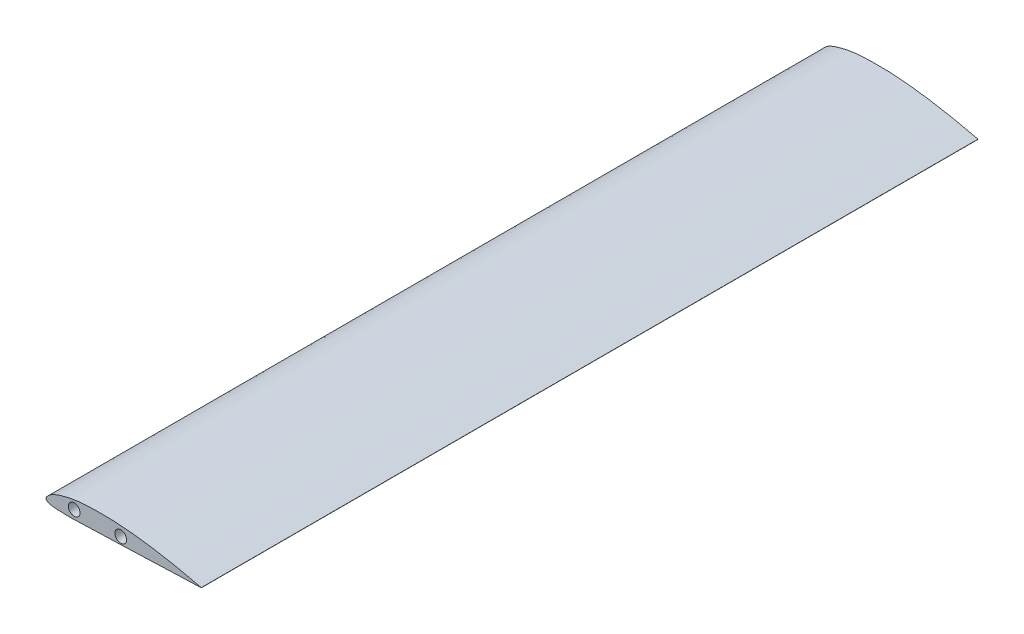
ISO-10303-21;
HEADER;
FILE_DESCRIPTION(('STEP AP214'),'2;1');
FILE_NAME('part.step','',(''),(''),'','','');
FILE_SCHEMA(('AUTOMOTIVE_DESIGN { 1 0 10303 214 1 1 1 1 }'));
ENDSEC;
DATA;
#1=APPLICATION_CONTEXT('core data for automotive mechanical design processes');
#2=APPLICATION_PROTOCOL_DEFINITION('international standard','automotive_design',2000,#1);
#3=PRODUCT_CONTEXT('',#1,'mechanical');
#4=PRODUCT('Part','Part','',(#3));
#5=PRODUCT_RELATED_PRODUCT_CATEGORY('part','',(#4));
#6=PRODUCT_DEFINITION_FORMATION('','',#4);
#7=PRODUCT_DEFINITION_CONTEXT('part definition',#1,'design');
#8=PRODUCT_DEFINITION('design','',#6,#7);
#9=PRODUCT_DEFINITION_SHAPE('','',#8);
#10=(LENGTH_UNIT() NAMED_UNIT(*) SI_UNIT(.MILLI.,.METRE.));
#11=(NAMED_UNIT(*) PLANE_ANGLE_UNIT() SI_UNIT($,.RADIAN.));
#12=(NAMED_UNIT(*) SI_UNIT($,.STERADIAN.) SOLID_ANGLE_UNIT());
#13=UNCERTAINTY_MEASURE_WITH_UNIT(LENGTH_MEASURE(1.E-05),#10,'distance_accuracy_value','');
#14=(GEOMETRIC_REPRESENTATION_CONTEXT(3) GLOBAL_UNCERTAINTY_ASSIGNED_CONTEXT((#13)) GLOBAL_UNIT_ASSIGNED_CONTEXT((#10,
#11,#12)) REPRESENTATION_CONTEXT('',''));
#15=CARTESIAN_POINT('',(0.,0.,0.));
#16=DIRECTION('',(0.,0.,1.));
#17=DIRECTION('',(1.,0.,0.));
#18=AXIS2_PLACEMENT_3D('',#15,#16,#17);
#19=CARTESIAN_POINT('',(50.8,0.0304292,254.));
#20=CARTESIAN_POINT('',(50.6306710197738,0.0705795841665533,254.));
#21=CARTESIAN_POINT('',(50.2920358300322,0.150874953230237,254.));
#22=CARTESIAN_POINT('',(49.7840539226607,0.270975498776032,254.));
#23=CARTESIAN_POINT('',(49.2761038610953,0.390637599713934,254.));
#24=CARTESIAN_POINT('',(48.598975977507,0.548855773634996,254.));
#25=CARTESIAN_POINT('',(47.7526078713655,0.743726875683231,254.));
#26=CARTESIAN_POINT('',(46.7365701063845,0.971867713773341,254.));
#27=CARTESIAN_POINT('',(45.7205157060592,1.19460366208644,254.));
#28=CARTESIAN_POINT('',(44.7045270504281,1.41244204379696,254.));
#29=CARTESIAN_POINT('',(43.6885263658982,1.62504804477995,254.));
#30=CARTESIAN_POINT('',(42.6725441857287,1.83238449031828,254.));
#31=CARTESIAN_POINT('',(41.6565222637134,2.0340240328905,254.));
#32=CARTESIAN_POINT('',(40.6405455167654,2.23021224046285,254.));
#33=CARTESIAN_POINT('',(39.6245166446479,2.42035781192709,254.));
#34=CARTESIAN_POINT('',(38.6085268570951,2.6047922516619,254.));
#35=CARTESIAN_POINT('',(37.5924948503536,2.78305004819871,254.));
#36=CARTESIAN_POINT('',(36.5764958949881,2.95547100648453,254.));
#37=CARTESIAN_POINT('',(35.5604833867921,3.12174023606919,254.));
#38=CARTESIAN_POINT('',(34.5444958340601,3.28187656499848,254.));
#39=CARTESIAN_POINT('',(33.528530885199,3.43549393879397,254.));
#40=CARTESIAN_POINT('',(32.5125313517329,3.58168689265324,254.));
#41=CARTESIAN_POINT('',(31.4965530833238,3.72022244299993,254.));
#42=CARTESIAN_POINT('',(30.480541120526,3.85017813303616,254.));
#43=CARTESIAN_POINT('',(29.1265064834059,4.011498540776,254.));
#44=CARTESIAN_POINT('',(27.7717198981147,4.15466436073355,254.));
#45=CARTESIAN_POINT('',(26.4163974210718,4.27955731480192,254.));
#46=CARTESIAN_POINT('',(25.4003621723501,4.36405904277595,254.));
#47=CARTESIAN_POINT('',(24.3843390537598,4.43934411421819,254.));
#48=CARTESIAN_POINT('',(23.0300417236,4.5266421839161,254.));
#49=CARTESIAN_POINT('',(21.6752328879528,4.59249103705621,254.));
#50=CARTESIAN_POINT('',(20.3201557818423,4.63369139201363,254.));
#51=CARTESIAN_POINT('',(19.3040696603435,4.65133426434404,254.));
#52=CARTESIAN_POINT('',(18.2879970526581,4.65656685695099,254.));
#53=CARTESIAN_POINT('',(17.2719426643878,4.65030742746952,254.));
#54=CARTESIAN_POINT('',(16.2559013261349,4.63383781370269,254.));
#55=CARTESIAN_POINT('',(15.2398767242405,4.60782186302995,254.));
#56=CARTESIAN_POINT('',(14.2237624314781,4.57411399170416,254.));
#57=CARTESIAN_POINT('',(13.2075470139113,4.52827070069848,254.));
#58=CARTESIAN_POINT('',(12.1911996459811,4.46545091171715,254.));
#59=CARTESIAN_POINT('',(11.1746982500042,4.38044787039092,254.));
#60=CARTESIAN_POINT('',(10.1579970051469,4.26835711799356,254.));
#61=CARTESIAN_POINT('',(9.14144422918915,4.12342634073343,254.));
#62=CARTESIAN_POINT('',(8.12503711717973,3.94534518557721,254.));
#63=CARTESIAN_POINT('',(7.10834817357695,3.7353756412971,254.));
#64=CARTESIAN_POINT('',(6.09103596588232,3.4913945761663,254.));
#65=CARTESIAN_POINT('',(5.07322112037564,3.20651396486868,254.));
#66=CARTESIAN_POINT('',(4.05555574990855,2.87195009447788,254.));
#67=CARTESIAN_POINT('',(3.20850188680405,2.55234560971134,254.));
#68=CARTESIAN_POINT('',(2.53341564299715,2.25166437345684,254.));
#69=CARTESIAN_POINT('',(2.02181497373695,1.98975816391644,254.));
#70=CARTESIAN_POINT('',(1.50561058745153,1.6785728005285,254.));
#71=CARTESIAN_POINT('',(1.02906174622136,1.31544995460392,254.));
#72=CARTESIAN_POINT('',(0.671173287285011,0.970843301204033,254.));
#73=CARTESIAN_POINT('',(0.397988147879069,0.69386553737046,254.));
#74=CARTESIAN_POINT('',(0.224504552344574,0.491374229286231,254.));
#75=CARTESIAN_POINT('',(0.110424088724365,0.31710182906547,254.));
#76=CARTESIAN_POINT('',(0.0546219702706747,0.202939448990948,254.));
#77=CARTESIAN_POINT('',(0.0189760115069539,0.10458386657566,254.));
#78=CARTESIAN_POINT('',(-0.0132923114343266,-0.0375239455911414,254.));
#79=CARTESIAN_POINT('',(0.00312147691093695,-0.185399330153303,254.));
#80=CARTESIAN_POINT('',(0.0545786117163274,-0.314116805654463,254.));
#81=CARTESIAN_POINT('',(0.10986225496766,-0.416474840227819,254.));
#82=CARTESIAN_POINT('',(0.222129250789671,-0.565689070251393,254.));
#83=CARTESIAN_POINT('',(0.393319805841126,-0.723830258003126,254.));
#84=CARTESIAN_POINT('',(0.660323780721179,-0.904551123356242,254.));
#85=CARTESIAN_POINT('',(1.03921450896585,-1.05093711353655,254.));
#86=CARTESIAN_POINT('',(1.52254987222713,-1.14831749172068,254.));
#87=CARTESIAN_POINT('',(2.0301899332059,-1.24926173467476,254.));
#88=CARTESIAN_POINT('',(2.53855615796006,-1.32684509795893,254.));
#89=CARTESIAN_POINT('',(3.21597130686952,-1.39867283087912,254.));
#90=CARTESIAN_POINT('',(4.06357406218937,-1.44738277140595,254.));
#91=CARTESIAN_POINT('',(5.07964625016984,-1.49564975144552,254.));
#92=CARTESIAN_POINT('',(6.0958432696135,-1.52465882720205,254.));
#93=CARTESIAN_POINT('',(7.11195166110082,-1.53841432772215,254.));
#94=CARTESIAN_POINT('',(8.12802940228787,-1.53883277396068,254.));
#95=CARTESIAN_POINT('',(9.14406755149236,-1.52797744925502,254.));
#96=CARTESIAN_POINT('',(10.4988520845856,-1.50158787792268,254.));
#97=CARTESIAN_POINT('',(11.8534935003071,-1.46132453292282,254.));
#98=CARTESIAN_POINT('',(13.2080403398518,-1.4134146374631,254.));
#99=CARTESIAN_POINT('',(14.2240157304614,-1.37530009783937,254.));
#100=CARTESIAN_POINT('',(15.2399886703084,-1.33631749729496,254.));
#101=CARTESIAN_POINT('',(16.2559861689052,-1.29810995512659,254.));
#102=CARTESIAN_POINT('',(17.2719941770759,-1.26071417961647,254.));
#103=CARTESIAN_POINT('',(18.2879947933126,-1.22356128004204,254.));
#104=CARTESIAN_POINT('',(19.3040013573683,-1.18675922158669,254.));
#105=CARTESIAN_POINT('',(20.3200028452941,-1.14983452199506,254.));
#106=CARTESIAN_POINT('',(21.3360026668478,-1.11274532920441,254.));
#107=CARTESIAN_POINT('',(22.3520031870673,-1.07552275046385,254.));
#108=CARTESIAN_POINT('',(23.3679994822182,-1.03808392176687,254.));
#109=CARTESIAN_POINT('',(24.3840013698953,-1.00072947091902,254.));
#110=CARTESIAN_POINT('',(25.3999987745551,-0.963253256998965,254.));
#111=CARTESIAN_POINT('',(26.4159991736496,-0.925875261572413,254.));
#112=CARTESIAN_POINT('',(27.4319989339051,-0.888530702527209,254.));
#113=CARTESIAN_POINT('',(29.1253338326584,-0.826411064856333,254.));
#114=CARTESIAN_POINT('',(30.8186661224185,-0.764237313762707,254.));
#115=CARTESIAN_POINT('',(32.8506686004358,-0.689696522061094,254.));
#116=CARTESIAN_POINT('',(34.2053308737201,-0.639826759521619,254.));
#117=CARTESIAN_POINT('',(35.5600014894901,-0.590167224598964,254.));
#118=CARTESIAN_POINT('',(36.5759984643119,-0.552780717457323,254.));
#119=CARTESIAN_POINT('',(37.5920015480668,-0.515543619607603,254.));
#120=CARTESIAN_POINT('',(38.6079984486163,-0.478155090073316,254.));
#121=CARTESIAN_POINT('',(39.6240015522729,-0.440918534137253,254.));
#122=CARTESIAN_POINT('',(40.6399984474876,-0.403529859339331,254.));
#123=CARTESIAN_POINT('',(41.6560015525816,-0.366293342543707,254.));
#124=CARTESIAN_POINT('',(42.6719984473813,-0.328904656447539,254.));
#125=CARTESIAN_POINT('',(43.6880015526977,-0.291668145704426,254.));
#126=CARTESIAN_POINT('',(44.7039984470231,-0.254279446696447,254.));
#127=CARTESIAN_POINT('',(45.7200015540143,-0.217042981548029,254.));
#128=CARTESIAN_POINT('',(46.7359984421147,-0.179654113072937,254.));
#129=CARTESIAN_POINT('',(47.7520015723316,-0.142418280197757,254.));
#130=CARTESIAN_POINT('',(48.5986656770232,-0.111258919636082,254.));
#131=CARTESIAN_POINT('',(49.2760001006052,-0.0864135387726242,254.));
#132=CARTESIAN_POINT('',(49.7839998488803,-0.0677630875746182,254.));
#133=CARTESIAN_POINT('',(50.2920011253363,-0.0491372881430579,254.));
#134=CARTESIAN_POINT('',(50.6306668346258,-0.0366652370098474,254.));
#135=CARTESIAN_POINT('',(50.8,-0.0304292,254.));
#136=B_SPLINE_CURVE_WITH_KNOTS('',3,(#19,#20,#21,#22,#23,#24,#25,#26,#27,#28,#29,#30,#31,#32,
#33,#34,#35,#36,#37,#38,#39,#40,#41,#42,#43,#44,#45,#46,#47,#48,#49,#50,#51,#52,#53,#54,#55,#56,
#57,#58,#59,#60,#61,#62,#63,#64,#65,#66,#67,#68,#69,#70,#71,#72,#73,#74,#75,#76,#77,#78,#79,#80,
#81,#82,#83,#84,#85,#86,#87,#88,#89,#90,#91,#92,#93,#94,#95,#96,#97,#98,#99,#100,#101,#102,#103,
#104,#105,#106,#107,#108,#109,#110,#111,#112,#113,#114,#115,#116,#117,#118,#119,#120,#121,#122,
#123,#124,#125,#126,#127,#128,#129,#130,#131,#132,#133,#134,#135),.UNSPECIFIED.,.F.,.F.,(4,1,1,
1,1,1,1,1,1,1,1,1,1,1,1,1,1,1,1,1,1,1,1,1,1,1,1,1,1,1,1,1,1,1,1,1,1,1,1,1,1,1,1,1,1,1,1,1,1,1,1,
1,1,1,1,1,1,1,1,1,1,1,1,1,1,1,1,1,1,1,1,1,1,1,1,1,1,1,1,1,1,1,1,1,1,1,1,1,1,1,1,1,1,1,1,1,1,1,1,
1,1,1,1,1,1,1,1,1,1,1,1,1,1,1,4),(0.,0.00502783507920512,0.0100549940344635,0.0150810297240759,
0.0201050549080901,0.0301452607809433,0.0401736458927437,0.0501907944797705,0.0601976798950131,
0.0701942255550733,0.080180376641249,0.0901559102827993,0.100121105793046,0.110075702815163,
0.120020101260909,0.12995427083149,0.139878706126609,0.149793490904473,0.159698811392376,
0.169594433213407,0.179479778460019,0.189354743837752,0.199219015443769,0.209072795450207,
0.228751158154273,0.238577241843568,0.248395636485294,0.258207018047657,0.268011852233636,
0.28760402315173,0.297393126728297,0.30717925271197,0.316964017963334,0.326748818989175,
0.336534714870927,0.346322473718417,0.356112722227348,0.365907651807351,0.375711463271154,
0.385530878969925,0.395375762487733,0.405259304622106,0.415192461064141,0.425184025337781,
0.435248335040234,0.445412190892236,0.455710778825161,0.466190958855658,0.471552192168147,
0.477054503678275,0.482786726573929,0.488945835105149,0.494316032866102,0.497126416153154,
0.500187367762256,0.50200086881537,0.50312820232303,0.503849971017213,0.505020136520667,
0.507317904862695,0.507986558007653,0.509023585585765,0.510668218535328,0.513358347504693,
0.515715811851598,0.519949385272463,0.524973187970153,0.529954400275476,0.534903201933464,
0.539824122915189,0.549630394385821,0.559425368878799,0.569214167199772,0.578999733437889,
0.588784364017045,0.598569510856094,0.608355932640458,0.627933314763684,0.637723968115274,
0.647515400204077,0.657307127187741,0.667098669129828,0.676889956114584,0.68668111741491,
0.69647218967302,0.706263279690747,0.716054423133804,0.725845620221906,0.735636871174764,
0.745428122127622,0.755219391084224,0.765010642037082,0.774801875010609,0.784593090029218,
0.813966735085043,0.823757950103652,0.843340416050707,0.853131631069315,0.862922864042843,
0.872714079061451,0.882505312034979,0.892296527053587,0.902087760027115,0.911878975045723,
0.92167020801925,0.931461423037859,0.941252656011386,0.951043871029995,0.960835104003522,
0.970626319022131,0.980417551995658,0.985313159504962,0.990208767014267,0.995104374523571,1.),.UNSPECIFIED.);
#137=DIRECTION('',(0.,0.,-1.));
#138=VECTOR('',#137,1.);
#139=SURFACE_OF_LINEAR_EXTRUSION('',#136,#138);
#140=CARTESIAN_POINT('',(50.8,0.0304292,0.));
#141=CARTESIAN_POINT('',(50.6306710197738,0.0705795841665533,0.));
#142=CARTESIAN_POINT('',(50.2920358300322,0.150874953230237,0.));
#143=CARTESIAN_POINT('',(49.7840539226607,0.270975498776032,0.));
#144=CARTESIAN_POINT('',(49.2761038610953,0.390637599713934,0.));
#145=CARTESIAN_POINT('',(48.598975977507,0.548855773634996,0.));
#146=CARTESIAN_POINT('',(47.7526078713655,0.743726875683231,0.));
#147=CARTESIAN_POINT('',(46.7365701063845,0.971867713773341,0.));
#148=CARTESIAN_POINT('',(45.7205157060592,1.19460366208644,0.));
#149=CARTESIAN_POINT('',(44.7045270504281,1.41244204379696,0.));
#150=CARTESIAN_POINT('',(43.6885263658982,1.62504804477995,0.));
#151=CARTESIAN_POINT('',(42.6725441857287,1.83238449031828,0.));
#152=CARTESIAN_POINT('',(41.6565222637134,2.0340240328905,0.));
#153=CARTESIAN_POINT('',(40.6405455167654,2.23021224046285,0.));
#154=CARTESIAN_POINT('',(39.6245166446479,2.42035781192709,0.));
#155=CARTESIAN_POINT('',(38.6085268570951,2.6047922516619,0.));
#156=CARTESIAN_POINT('',(37.5924948503536,2.78305004819871,0.));
#157=CARTESIAN_POINT('',(36.5764958949881,2.95547100648453,0.));
#158=CARTESIAN_POINT('',(35.5604833867921,3.12174023606919,0.));
#159=CARTESIAN_POINT('',(34.5444958340601,3.28187656499848,0.));
#160=CARTESIAN_POINT('',(33.528530885199,3.43549393879397,0.));
#161=CARTESIAN_POINT('',(32.5125313517329,3.58168689265324,0.));
#162=CARTESIAN_POINT('',(31.4965530833238,3.72022244299993,0.));
#163=CARTESIAN_POINT('',(30.480541120526,3.85017813303616,0.));
#164=CARTESIAN_POINT('',(29.1265064834059,4.011498540776,0.));
#165=CARTESIAN_POINT('',(27.7717198981147,4.15466436073355,0.));
#166=CARTESIAN_POINT('',(26.4163974210718,4.27955731480192,0.));
#167=CARTESIAN_POINT('',(25.4003621723501,4.36405904277595,0.));
#168=CARTESIAN_POINT('',(24.3843390537598,4.43934411421819,0.));
#169=CARTESIAN_POINT('',(23.0300417236,4.5266421839161,0.));
#170=CARTESIAN_POINT('',(21.6752328879528,4.59249103705621,0.));
#171=CARTESIAN_POINT('',(20.3201557818423,4.63369139201363,0.));
#172=CARTESIAN_POINT('',(19.3040696603435,4.65133426434404,0.));
#173=CARTESIAN_POINT('',(18.2879970526581,4.65656685695099,0.));
#174=CARTESIAN_POINT('',(17.2719426643878,4.65030742746952,0.));
#175=CARTESIAN_POINT('',(16.2559013261349,4.63383781370269,0.));
#176=CARTESIAN_POINT('',(15.2398767242405,4.60782186302995,0.));
#177=CARTESIAN_POINT('',(14.2237624314781,4.57411399170416,0.));
#178=CARTESIAN_POINT('',(13.2075470139113,4.52827070069848,0.));
#179=CARTESIAN_POINT('',(12.1911996459811,4.46545091171715,0.));
#180=CARTESIAN_POINT('',(11.1746982500042,4.38044787039092,0.));
#181=CARTESIAN_POINT('',(10.1579970051469,4.26835711799356,0.));
#182=CARTESIAN_POINT('',(9.14144422918915,4.12342634073343,0.));
#183=CARTESIAN_POINT('',(8.12503711717973,3.94534518557721,0.));
#184=CARTESIAN_POINT('',(7.10834817357695,3.7353756412971,0.));
#185=CARTESIAN_POINT('',(6.09103596588232,3.4913945761663,0.));
#186=CARTESIAN_POINT('',(5.07322112037564,3.20651396486868,0.));
#187=CARTESIAN_POINT('',(4.05555574990855,2.87195009447788,0.));
#188=CARTESIAN_POINT('',(3.20850188680405,2.55234560971134,0.));
#189=CARTESIAN_POINT('',(2.53341564299715,2.25166437345684,0.));
#190=CARTESIAN_POINT('',(2.02181497373695,1.98975816391644,0.));
#191=CARTESIAN_POINT('',(1.50561058745153,1.6785728005285,0.));
#192=CARTESIAN_POINT('',(1.02906174622136,1.31544995460392,0.));
#193=CARTESIAN_POINT('',(0.671173287285011,0.970843301204033,0.));
#194=CARTESIAN_POINT('',(0.397988147879069,0.69386553737046,0.));
#195=CARTESIAN_POINT('',(0.224504552344574,0.491374229286231,0.));
#196=CARTESIAN_POINT('',(0.110424088724365,0.31710182906547,0.));
#197=CARTESIAN_POINT('',(0.0546219702706747,0.202939448990948,0.));
#198=CARTESIAN_POINT('',(0.0189760115069539,0.10458386657566,0.));
#199=CARTESIAN_POINT('',(-0.0132923114343266,-0.0375239455911414,0.));
#200=CARTESIAN_POINT('',(0.00312147691093695,-0.185399330153303,0.));
#201=CARTESIAN_POINT('',(0.0545786117163274,-0.314116805654463,0.));
#202=CARTESIAN_POINT('',(0.10986225496766,-0.416474840227819,0.));
#203=CARTESIAN_POINT('',(0.222129250789671,-0.565689070251393,0.));
#204=CARTESIAN_POINT('',(0.393319805841126,-0.723830258003126,0.));
#205=CARTESIAN_POINT('',(0.660323780721179,-0.904551123356242,0.));
#206=CARTESIAN_POINT('',(1.03921450896585,-1.05093711353655,0.));
#207=CARTESIAN_POINT('',(1.52254987222713,-1.14831749172068,0.));
#208=CARTESIAN_POINT('',(2.0301899332059,-1.24926173467476,0.));
#209=CARTESIAN_POINT('',(2.53855615796006,-1.32684509795893,0.));
#210=CARTESIAN_POINT('',(3.21597130686952,-1.39867283087912,0.));
#211=CARTESIAN_POINT('',(4.06357406218937,-1.44738277140595,0.));
#212=CARTESIAN_POINT('',(5.07964625016984,-1.49564975144552,0.));
#213=CARTESIAN_POINT('',(6.0958432696135,-1.52465882720205,0.));
#214=CARTESIAN_POINT('',(7.11195166110082,-1.53841432772215,0.));
#215=CARTESIAN_POINT('',(8.12802940228787,-1.53883277396068,0.));
#216=CARTESIAN_POINT('',(9.14406755149236,-1.52797744925502,0.));
#217=CARTESIAN_POINT('',(10.4988520845856,-1.50158787792268,0.));
#218=CARTESIAN_POINT('',(11.8534935003071,-1.46132453292282,0.));
#219=CARTESIAN_POINT('',(13.2080403398518,-1.4134146374631,0.));
#220=CARTESIAN_POINT('',(14.2240157304614,-1.37530009783937,0.));
#221=CARTESIAN_POINT('',(15.2399886703084,-1.33631749729496,0.));
#222=CARTESIAN_POINT('',(16.2559861689052,-1.29810995512659,0.));
#223=CARTESIAN_POINT('',(17.2719941770759,-1.26071417961647,0.));
#224=CARTESIAN_POINT('',(18.2879947933126,-1.22356128004204,0.));
#225=CARTESIAN_POINT('',(19.3040013573683,-1.18675922158669,0.));
#226=CARTESIAN_POINT('',(20.3200028452941,-1.14983452199506,0.));
#227=CARTESIAN_POINT('',(21.3360026668478,-1.11274532920441,0.));
#228=CARTESIAN_POINT('',(22.3520031870673,-1.07552275046385,0.));
#229=CARTESIAN_POINT('',(23.3679994822182,-1.03808392176687,0.));
#230=CARTESIAN_POINT('',(24.3840013698953,-1.00072947091902,0.));
#231=CARTESIAN_POINT('',(25.3999987745551,-0.963253256998965,0.));
#232=CARTESIAN_POINT('',(26.4159991736496,-0.925875261572413,0.));
#233=CARTESIAN_POINT('',(27.4319989339051,-0.888530702527209,0.));
#234=CARTESIAN_POINT('',(29.1253338326584,-0.826411064856333,0.));
#235=CARTESIAN_POINT('',(30.8186661224185,-0.764237313762707,0.));
#236=CARTESIAN_POINT('',(32.8506686004358,-0.689696522061094,0.));
#237=CARTESIAN_POINT('',(34.2053308737201,-0.639826759521619,0.));
#238=CARTESIAN_POINT('',(35.5600014894901,-0.590167224598964,0.));
#239=CARTESIAN_POINT('',(36.5759984643119,-0.552780717457323,0.));
#240=CARTESIAN_POINT('',(37.5920015480668,-0.515543619607603,0.));
#241=CARTESIAN_POINT('',(38.6079984486163,-0.478155090073316,0.));
#242=CARTESIAN_POINT('',(39.6240015522729,-0.440918534137253,0.));
#243=CARTESIAN_POINT('',(40.6399984474876,-0.403529859339331,0.));
#244=CARTESIAN_POINT('',(41.6560015525816,-0.366293342543707,0.));
#245=CARTESIAN_POINT('',(42.6719984473813,-0.328904656447539,0.));
#246=CARTESIAN_POINT('',(43.6880015526977,-0.291668145704426,0.));
#247=CARTESIAN_POINT('',(44.7039984470231,-0.254279446696447,0.));
#248=CARTESIAN_POINT('',(45.7200015540143,-0.217042981548029,0.));
#249=CARTESIAN_POINT('',(46.7359984421147,-0.179654113072937,0.));
#250=CARTESIAN_POINT('',(47.7520015723316,-0.142418280197757,0.));
#251=CARTESIAN_POINT('',(48.5986656770232,-0.111258919636082,0.));
#252=CARTESIAN_POINT('',(49.2760001006052,-0.0864135387726242,0.));
#253=CARTESIAN_POINT('',(49.7839998488803,-0.0677630875746182,0.));
#254=CARTESIAN_POINT('',(50.2920011253363,-0.0491372881430579,0.));
#255=CARTESIAN_POINT('',(50.6306668346258,-0.0366652370098474,0.));
#256=CARTESIAN_POINT('',(50.8,-0.0304292,0.));
#257=B_SPLINE_CURVE_WITH_KNOTS('',3,(#140,#141,#142,#143,#144,#145,#146,#147,#148,#149,#150,
#151,#152,#153,#154,#155,#156,#157,#158,#159,#160,#161,#162,#163,#164,#165,#166,#167,#168,#169,
#170,#171,#172,#173,#174,#175,#176,#177,#178,#179,#180,#181,#182,#183,#184,#185,#186,#187,#188,
#189,#190,#191,#192,#193,#194,#195,#196,#197,#198,#199,#200,#201,#202,#203,#204,#205,#206,#207,
#208,#209,#210,#211,#212,#213,#214,#215,#216,#217,#218,#219,#220,#221,#222,#223,#224,#225,#226,
#227,#228,#229,#230,#231,#232,#233,#234,#235,#236,#237,#238,#239,#240,#241,#242,#243,#244,#245,
#246,#247,#248,#249,#250,#251,#252,#253,#254,#255,#256),.UNSPECIFIED.,.F.,.F.,(4,1,1,1,1,1,1,1,
1,1,1,1,1,1,1,1,1,1,1,1,1,1,1,1,1,1,1,1,1,1,1,1,1,1,1,1,1,1,1,1,1,1,1,1,1,1,1,1,1,1,1,1,1,1,1,1,
1,1,1,1,1,1,1,1,1,1,1,1,1,1,1,1,1,1,1,1,1,1,1,1,1,1,1,1,1,1,1,1,1,1,1,1,1,1,1,1,1,1,1,1,1,1,1,1,
1,1,1,1,1,1,1,1,1,1,4),(0.,0.00502783507920512,0.0100549940344635,0.0150810297240759,
0.0201050549080901,0.0301452607809433,0.0401736458927437,0.0501907944797705,0.0601976798950131,
0.0701942255550733,0.080180376641249,0.0901559102827993,0.100121105793046,0.110075702815163,
0.120020101260909,0.12995427083149,0.139878706126609,0.149793490904473,0.159698811392376,
0.169594433213407,0.179479778460019,0.189354743837752,0.199219015443769,0.209072795450207,
0.228751158154273,0.238577241843568,0.248395636485294,0.258207018047657,0.268011852233636,
0.28760402315173,0.297393126728297,0.30717925271197,0.316964017963334,0.326748818989175,
0.336534714870927,0.346322473718417,0.356112722227348,0.365907651807351,0.375711463271154,
0.385530878969925,0.395375762487733,0.405259304622106,0.415192461064141,0.425184025337781,
0.435248335040234,0.445412190892236,0.455710778825161,0.466190958855658,0.471552192168147,
0.477054503678275,0.482786726573929,0.488945835105149,0.494316032866102,0.497126416153154,
0.500187367762256,0.50200086881537,0.50312820232303,0.503849971017213,0.505020136520667,
0.507317904862695,0.507986558007653,0.509023585585765,0.510668218535328,0.513358347504693,
0.515715811851598,0.519949385272463,0.524973187970153,0.529954400275476,0.534903201933464,
0.539824122915189,0.549630394385821,0.559425368878799,0.569214167199772,0.578999733437889,
0.588784364017045,0.598569510856094,0.608355932640458,0.627933314763684,0.637723968115274,
0.647515400204077,0.657307127187741,0.667098669129828,0.676889956114584,0.68668111741491,
0.69647218967302,0.706263279690747,0.716054423133804,0.725845620221906,0.735636871174764,
0.745428122127622,0.755219391084224,0.765010642037082,0.774801875010609,0.784593090029218,
0.813966735085043,0.823757950103652,0.843340416050707,0.853131631069315,0.862922864042843,
0.872714079061451,0.882505312034979,0.892296527053587,0.902087760027115,0.911878975045723,
0.92167020801925,0.931461423037859,0.941252656011386,0.951043871029995,0.960835104003522,
0.970626319022131,0.980417551995658,0.985313159504962,0.990208767014267,0.995104374523571,1.),.UNSPECIFIED.);
#258=CARTESIAN_POINT('',(50.8,0.0304292,0.));
#259=VERTEX_POINT('',#258);
#260=CARTESIAN_POINT('',(50.8,-0.0304292,0.));
#261=VERTEX_POINT('',#260);
#262=EDGE_CURVE('E69',#259,#261,#257,.T.);
#263=ORIENTED_EDGE('',*,*,#262,.T.);
#264=DIRECTION('',(0.,0.,-1.));
#265=VECTOR('',#264,1.);
#266=CARTESIAN_POINT('',(50.8,-0.0304292,254.));
#267=LINE('',#266,#265);
#268=CARTESIAN_POINT('',(50.8,-0.0304292,254.));
#269=VERTEX_POINT('',#268);
#270=EDGE_CURVE('E11',#269,#261,#267,.T.);
#271=ORIENTED_EDGE('',*,*,#270,.F.);
#272=CARTESIAN_POINT('',(50.8,0.0304292,254.));
#273=VERTEX_POINT('',#272);
#274=EDGE_CURVE('E68',#273,#269,#136,.T.);
#275=ORIENTED_EDGE('',*,*,#274,.F.);
#276=DIRECTION('',(0.,0.,-1.));
#277=VECTOR('',#276,1.);
#278=CARTESIAN_POINT('',(50.8,0.0304292,254.));
#279=LINE('',#278,#277);
#280=EDGE_CURVE('E46',#273,#259,#279,.T.);
#281=ORIENTED_EDGE('',*,*,#280,.T.);
#282=EDGE_LOOP('',(#263,#271,#275,#281));
#283=FACE_BOUND('',#282,.T.);
#284=ADVANCED_FACE('F37',(#283),#139,.F.);
#285=CARTESIAN_POINT('',(50.8,0.0304292,254.));
#286=DIRECTION('',(-1.,0.,0.));
#287=DIRECTION('',(0.,0.,1.));
#288=AXIS2_PLACEMENT_3D('',#285,#286,#287);
#289=PLANE('',#288);
#290=DIRECTION('',(0.,1.,0.));
#291=VECTOR('',#290,1.);
#292=CARTESIAN_POINT('',(50.8,0.0304292,0.));
#293=LINE('',#292,#291);
#294=EDGE_CURVE('E61',#261,#259,#293,.T.);
#295=ORIENTED_EDGE('',*,*,#294,.T.);
#296=ORIENTED_EDGE('',*,*,#280,.F.);
#297=DIRECTION('',(0.,1.,0.));
#298=VECTOR('',#297,1.);
#299=CARTESIAN_POINT('',(50.8,0.0304292,254.));
#300=LINE('',#299,#298);
#301=EDGE_CURVE('E53',#269,#273,#300,.T.);
#302=ORIENTED_EDGE('',*,*,#301,.F.);
#303=ORIENTED_EDGE('',*,*,#270,.T.);
#304=EDGE_LOOP('',(#295,#296,#302,#303));
#305=FACE_BOUND('',#304,.T.);
#306=ADVANCED_FACE('F64',(#305),#289,.F.);
#307=CARTESIAN_POINT('',(0.214706412229937,0.469041368803718,254.));
#308=DIRECTION('',(0.,0.,-1.));
#309=DIRECTION('',(-1.,0.,0.));
#310=AXIS2_PLACEMENT_3D('',#307,#308,#309);
#311=PLANE('',#310);
#312=CARTESIAN_POINT('',(9.22028470859923,1.33543963282501,254.));
#313=DIRECTION('',(0.,0.,1.));
#314=DIRECTION('',(1.,0.,0.));
#315=AXIS2_PLACEMENT_3D('',#312,#313,#314);
#316=CIRCLE('',#315,1.905);
#317=CARTESIAN_POINT('',(11.1252847085992,1.33543963282501,254.));
#318=VERTEX_POINT('',#317);
#319=EDGE_CURVE('E76',#318,#318,#316,.T.);
#320=ORIENTED_EDGE('',*,*,#319,.F.);
#321=EDGE_LOOP('',(#320));
#322=FACE_BOUND('',#321,.T.);
#323=CARTESIAN_POINT('',(24.4602847085992,1.33543963282501,254.));
#324=DIRECTION('',(0.,0.,1.));
#325=DIRECTION('',(1.,0.,0.));
#326=AXIS2_PLACEMENT_3D('',#323,#324,#325);
#327=CIRCLE('',#326,1.905);
#328=CARTESIAN_POINT('',(26.3652847085992,1.33543963282501,254.));
#329=VERTEX_POINT('',#328);
#330=EDGE_CURVE('E94',#329,#329,#327,.T.);
#331=ORIENTED_EDGE('',*,*,#330,.F.);
#332=EDGE_LOOP('',(#331));
#333=FACE_BOUND('',#332,.T.);
#334=ORIENTED_EDGE('',*,*,#274,.T.);
#335=ORIENTED_EDGE('',*,*,#301,.T.);
#336=EDGE_LOOP('',(#334,#335));
#337=FACE_BOUND('',#336,.T.);
#338=ADVANCED_FACE('F102',(#322,#333,#337),#311,.F.);
#339=CARTESIAN_POINT('',(0.214706412229937,0.469041368803718,0.));
#340=DIRECTION('',(0.,0.,-1.));
#341=DIRECTION('',(-1.,0.,0.));
#342=AXIS2_PLACEMENT_3D('',#339,#340,#341);
#343=PLANE('',#342);
#344=ORIENTED_EDGE('',*,*,#262,.F.);
#345=ORIENTED_EDGE('',*,*,#294,.F.);
#346=EDGE_LOOP('',(#344,#345));
#347=FACE_BOUND('',#346,.T.);
#348=ADVANCED_FACE('F72',(#347),#343,.T.);
#349=CARTESIAN_POINT('',(24.4602847085992,1.33543963282501,241.3));
#350=DIRECTION('',(0.,0.,1.));
#351=DIRECTION('',(1.,0.,0.));
#352=AXIS2_PLACEMENT_3D('',#349,#350,#351);
#353=CYLINDRICAL_SURFACE('',#352,1.905);
#354=CARTESIAN_POINT('',(24.4602847085992,1.33543963282501,241.3));
#355=DIRECTION('',(0.,0.,1.));
#356=DIRECTION('',(1.,0.,0.));
#357=AXIS2_PLACEMENT_3D('',#354,#355,#356);
#358=CIRCLE('',#357,1.905);
#359=CARTESIAN_POINT('',(26.3652847085992,1.33543963282501,241.3));
#360=VERTEX_POINT('',#359);
#361=EDGE_CURVE('E88',#360,#360,#358,.T.);
#362=ORIENTED_EDGE('',*,*,#361,.F.);
#363=EDGE_LOOP('',(#362));
#364=FACE_BOUND('',#363,.T.);
#365=ORIENTED_EDGE('',*,*,#330,.T.);
#366=EDGE_LOOP('',(#365));
#367=FACE_BOUND('',#366,.T.);
#368=ADVANCED_FACE('F108',(#364,#367),#353,.F.);
#369=CARTESIAN_POINT('',(24.4602847085992,1.33543963282501,241.3));
#370=DIRECTION('',(0.,0.,1.));
#371=DIRECTION('',(1.,0.,0.));
#372=AXIS2_PLACEMENT_3D('',#369,#370,#371);
#373=PLANE('',#372);
#374=ORIENTED_EDGE('',*,*,#361,.T.);
#375=EDGE_LOOP('',(#374));
#376=FACE_BOUND('',#375,.T.);
#377=ADVANCED_FACE('F110',(#376),#373,.T.);
#378=CARTESIAN_POINT('',(9.22028470859923,1.33543963282501,241.3));
#379=DIRECTION('',(0.,0.,1.));
#380=DIRECTION('',(1.,0.,0.));
#381=AXIS2_PLACEMENT_3D('',#378,#379,#380);
#382=CYLINDRICAL_SURFACE('',#381,1.905);
#383=CARTESIAN_POINT('',(9.22028470859923,1.33543963282501,241.3));
#384=DIRECTION('',(0.,0.,1.));
#385=DIRECTION('',(1.,0.,0.));
#386=AXIS2_PLACEMENT_3D('',#383,#384,#385);
#387=CIRCLE('',#386,1.905);
#388=CARTESIAN_POINT('',(11.1252847085992,1.33543963282501,241.3));
#389=VERTEX_POINT('',#388);
#390=EDGE_CURVE('E73',#389,#389,#387,.T.);
#391=ORIENTED_EDGE('',*,*,#390,.F.);
#392=EDGE_LOOP('',(#391));
#393=FACE_BOUND('',#392,.T.);
#394=ORIENTED_EDGE('',*,*,#319,.T.);
#395=EDGE_LOOP('',(#394));
#396=FACE_BOUND('',#395,.T.);
#397=ADVANCED_FACE('F100',(#393,#396),#382,.F.);
#398=CARTESIAN_POINT('',(9.22028470859923,1.33543963282501,241.3));
#399=DIRECTION('',(0.,0.,1.));
#400=DIRECTION('',(1.,0.,0.));
#401=AXIS2_PLACEMENT_3D('',#398,#399,#400);
#402=PLANE('',#401);
#403=ORIENTED_EDGE('',*,*,#390,.T.);
#404=EDGE_LOOP('',(#403));
#405=FACE_BOUND('',#404,.T.);
#406=ADVANCED_FACE('F165',(#405),#402,.T.);
#407=CLOSED_SHELL('',(#284,#306,#338,#348,#368,#377,#397,#406));
#408=MANIFOLD_SOLID_BREP('B2',#407);
#409=ADVANCED_BREP_SHAPE_REPRESENTATION('',(#18,#408),#14);
#410=SHAPE_DEFINITION_REPRESENTATION(#9,#409);
ENDSEC;
END-ISO-10303-21;
